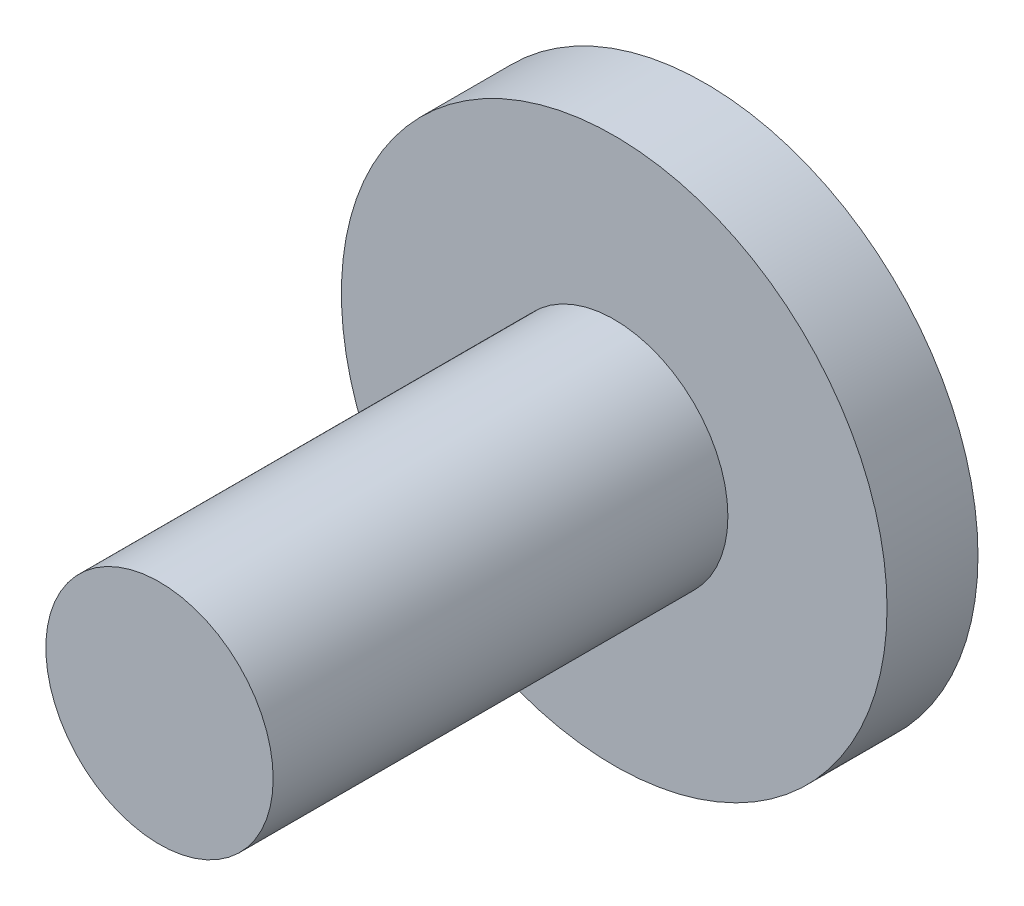
ISO-10303-21;
HEADER;
FILE_DESCRIPTION(('STEP AP214'),'2;1');
FILE_NAME('part.step','',(''),(''),'','','');
FILE_SCHEMA(('AUTOMOTIVE_DESIGN { 1 0 10303 214 1 1 1 1 }'));
ENDSEC;
DATA;
#1=APPLICATION_CONTEXT('core data for automotive mechanical design processes');
#2=APPLICATION_PROTOCOL_DEFINITION('international standard','automotive_design',2000,#1);
#3=PRODUCT_CONTEXT('',#1,'mechanical');
#4=PRODUCT('Part','Part','',(#3));
#5=PRODUCT_RELATED_PRODUCT_CATEGORY('part','',(#4));
#6=PRODUCT_DEFINITION_FORMATION('','',#4);
#7=PRODUCT_DEFINITION_CONTEXT('part definition',#1,'design');
#8=PRODUCT_DEFINITION('design','',#6,#7);
#9=PRODUCT_DEFINITION_SHAPE('','',#8);
#10=(LENGTH_UNIT() NAMED_UNIT(*) SI_UNIT(.MILLI.,.METRE.));
#11=(NAMED_UNIT(*) PLANE_ANGLE_UNIT() SI_UNIT($,.RADIAN.));
#12=(NAMED_UNIT(*) SI_UNIT($,.STERADIAN.) SOLID_ANGLE_UNIT());
#13=UNCERTAINTY_MEASURE_WITH_UNIT(LENGTH_MEASURE(1.E-05),#10,'distance_accuracy_value','');
#14=(GEOMETRIC_REPRESENTATION_CONTEXT(3) GLOBAL_UNCERTAINTY_ASSIGNED_CONTEXT((#13)) GLOBAL_UNIT_ASSIGNED_CONTEXT((#10,
#11,#12)) REPRESENTATION_CONTEXT('',''));
#15=CARTESIAN_POINT('',(0.,0.,0.));
#16=DIRECTION('',(0.,0.,1.));
#17=DIRECTION('',(1.,0.,0.));
#18=AXIS2_PLACEMENT_3D('',#15,#16,#17);
#19=CARTESIAN_POINT('',(0.,0.,-2.));
#20=DIRECTION('',(0.,0.,1.));
#21=DIRECTION('',(1.,0.,0.));
#22=AXIS2_PLACEMENT_3D('',#19,#20,#21);
#23=CYLINDRICAL_SURFACE('',#22,6.);
#24=CARTESIAN_POINT('',(0.,0.,-2.));
#25=DIRECTION('',(0.,0.,1.));
#26=DIRECTION('',(1.,0.,0.));
#27=AXIS2_PLACEMENT_3D('',#24,#25,#26);
#28=CIRCLE('',#27,6.);
#29=CARTESIAN_POINT('',(6.,0.,-2.));
#30=VERTEX_POINT('',#29);
#31=EDGE_CURVE('E11',#30,#30,#28,.T.);
#32=ORIENTED_EDGE('',*,*,#31,.T.);
#33=EDGE_LOOP('',(#32));
#34=FACE_BOUND('',#33,.T.);
#35=CARTESIAN_POINT('',(0.,0.,0.));
#36=DIRECTION('',(0.,0.,1.));
#37=DIRECTION('',(1.,0.,0.));
#38=AXIS2_PLACEMENT_3D('',#35,#36,#37);
#39=CIRCLE('',#38,6.);
#40=CARTESIAN_POINT('',(6.,0.,0.));
#41=VERTEX_POINT('',#40);
#42=EDGE_CURVE('E50',#41,#41,#39,.T.);
#43=ORIENTED_EDGE('',*,*,#42,.F.);
#44=EDGE_LOOP('',(#43));
#45=FACE_BOUND('',#44,.T.);
#46=ADVANCED_FACE('F47',(#34,#45),#23,.T.);
#47=CARTESIAN_POINT('',(0.,0.,-2.));
#48=DIRECTION('',(0.,0.,1.));
#49=DIRECTION('',(1.,0.,0.));
#50=AXIS2_PLACEMENT_3D('',#47,#48,#49);
#51=PLANE('',#50);
#52=ORIENTED_EDGE('',*,*,#31,.F.);
#53=EDGE_LOOP('',(#52));
#54=FACE_BOUND('',#53,.T.);
#55=ADVANCED_FACE('F62',(#54),#51,.F.);
#56=CARTESIAN_POINT('',(0.,0.,0.));
#57=DIRECTION('',(0.,0.,1.));
#58=DIRECTION('',(1.,0.,0.));
#59=AXIS2_PLACEMENT_3D('',#56,#57,#58);
#60=PLANE('',#59);
#61=ORIENTED_EDGE('',*,*,#42,.T.);
#62=EDGE_LOOP('',(#61));
#63=FACE_BOUND('',#62,.T.);
#64=ADVANCED_FACE('F59',(#63),#60,.T.);
#65=CLOSED_SHELL('',(#46,#55,#64));
#66=MANIFOLD_SOLID_BREP('B2',#65);
#67=CARTESIAN_POINT('',(0.,0.,10.));
#68=DIRECTION('',(0.,0.,-1.));
#69=DIRECTION('',(-1.,0.,0.));
#70=AXIS2_PLACEMENT_3D('',#67,#68,#69);
#71=CYLINDRICAL_SURFACE('',#70,2.5);
#72=CARTESIAN_POINT('',(0.,0.,10.));
#73=DIRECTION('',(0.,0.,1.));
#74=DIRECTION('',(1.,0.,0.));
#75=AXIS2_PLACEMENT_3D('',#72,#73,#74);
#76=CIRCLE('',#75,2.5);
#77=CARTESIAN_POINT('',(2.5,0.,10.));
#78=VERTEX_POINT('',#77);
#79=EDGE_CURVE('E46',#78,#78,#76,.T.);
#80=ORIENTED_EDGE('',*,*,#79,.F.);
#81=EDGE_LOOP('',(#80));
#82=FACE_BOUND('',#81,.T.);
#83=CARTESIAN_POINT('',(0.,0.,0.));
#84=DIRECTION('',(0.,0.,1.));
#85=DIRECTION('',(1.,0.,0.));
#86=AXIS2_PLACEMENT_3D('',#83,#84,#85);
#87=CIRCLE('',#86,2.5);
#88=CARTESIAN_POINT('',(2.5,0.,0.));
#89=VERTEX_POINT('',#88);
#90=EDGE_CURVE('E91',#89,#89,#87,.T.);
#91=ORIENTED_EDGE('',*,*,#90,.T.);
#92=EDGE_LOOP('',(#91));
#93=FACE_BOUND('',#92,.T.);
#94=ADVANCED_FACE('F88',(#82,#93),#71,.T.);
#95=CARTESIAN_POINT('',(0.,0.,10.));
#96=DIRECTION('',(0.,0.,1.));
#97=DIRECTION('',(1.,0.,0.));
#98=AXIS2_PLACEMENT_3D('',#95,#96,#97);
#99=PLANE('',#98);
#100=ORIENTED_EDGE('',*,*,#79,.T.);
#101=EDGE_LOOP('',(#100));
#102=FACE_BOUND('',#101,.T.);
#103=ADVANCED_FACE('F103',(#102),#99,.T.);
#104=CARTESIAN_POINT('',(0.,0.,0.));
#105=DIRECTION('',(0.,0.,1.));
#106=DIRECTION('',(1.,0.,0.));
#107=AXIS2_PLACEMENT_3D('',#104,#105,#106);
#108=PLANE('',#107);
#109=ORIENTED_EDGE('',*,*,#90,.F.);
#110=EDGE_LOOP('',(#109));
#111=FACE_BOUND('',#110,.T.);
#112=ADVANCED_FACE('F101',(#111),#108,.F.);
#113=CLOSED_SHELL('',(#94,#103,#112));
#114=MANIFOLD_SOLID_BREP('B6',#113);
#115=ADVANCED_BREP_SHAPE_REPRESENTATION('',(#18,#66,#114),#14);
#116=SHAPE_DEFINITION_REPRESENTATION(#9,#115);
ENDSEC;
END-ISO-10303-21;
